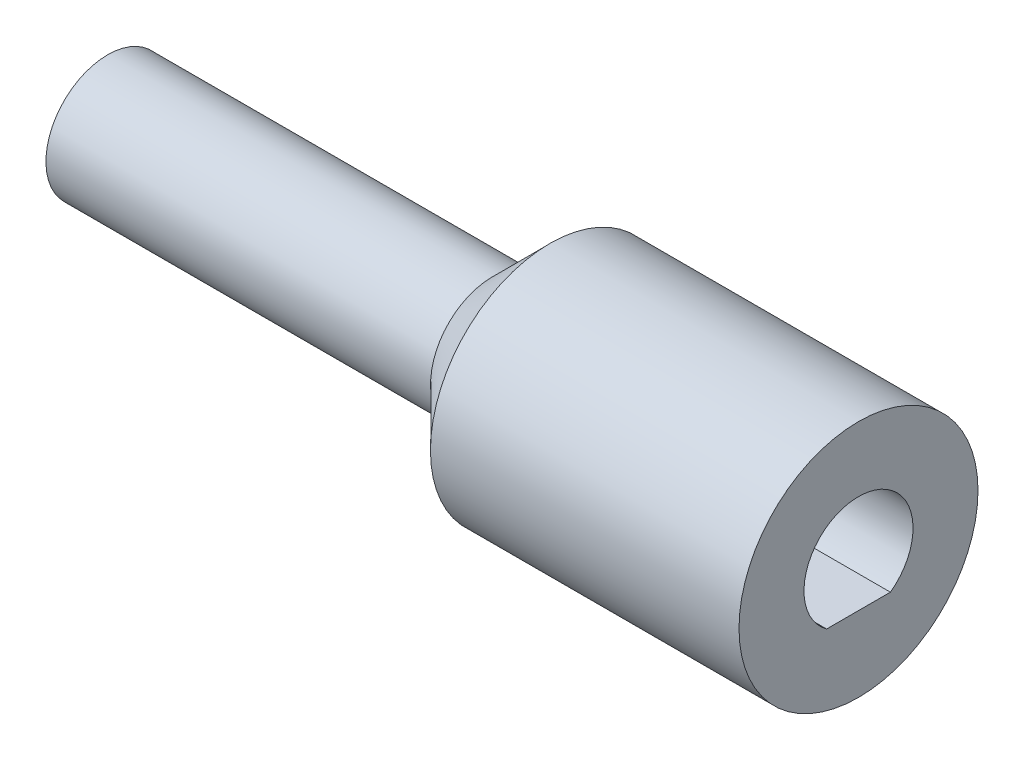
ISO-10303-21;
HEADER;
FILE_DESCRIPTION(('STEP AP214'),'2;1');
FILE_NAME('part.step','',(''),(''),'','','');
FILE_SCHEMA(('AUTOMOTIVE_DESIGN { 1 0 10303 214 1 1 1 1 }'));
ENDSEC;
DATA;
#1=APPLICATION_CONTEXT('core data for automotive mechanical design processes');
#2=APPLICATION_PROTOCOL_DEFINITION('international standard','automotive_design',2000,#1);
#3=PRODUCT_CONTEXT('',#1,'mechanical');
#4=PRODUCT('Part','Part','',(#3));
#5=PRODUCT_RELATED_PRODUCT_CATEGORY('part','',(#4));
#6=PRODUCT_DEFINITION_FORMATION('','',#4);
#7=PRODUCT_DEFINITION_CONTEXT('part definition',#1,'design');
#8=PRODUCT_DEFINITION('design','',#6,#7);
#9=PRODUCT_DEFINITION_SHAPE('','',#8);
#10=(LENGTH_UNIT() NAMED_UNIT(*) SI_UNIT(.MILLI.,.METRE.));
#11=(NAMED_UNIT(*) PLANE_ANGLE_UNIT() SI_UNIT($,.RADIAN.));
#12=(NAMED_UNIT(*) SI_UNIT($,.STERADIAN.) SOLID_ANGLE_UNIT());
#13=UNCERTAINTY_MEASURE_WITH_UNIT(LENGTH_MEASURE(1.E-05),#10,'distance_accuracy_value','');
#14=(GEOMETRIC_REPRESENTATION_CONTEXT(3) GLOBAL_UNCERTAINTY_ASSIGNED_CONTEXT((#13)) GLOBAL_UNIT_ASSIGNED_CONTEXT((#10,
#11,#12)) REPRESENTATION_CONTEXT('',''));
#15=CARTESIAN_POINT('',(0.,0.,0.));
#16=DIRECTION('',(0.,0.,1.));
#17=DIRECTION('',(1.,0.,0.));
#18=AXIS2_PLACEMENT_3D('',#15,#16,#17);
#19=CARTESIAN_POINT('',(-9.98528137423857,0.,0.));
#20=DIRECTION('',(1.,0.,0.));
#21=DIRECTION('',(0.,0.,-1.));
#22=AXIS2_PLACEMENT_3D('',#19,#20,#21);
#23=CYLINDRICAL_SURFACE('',#22,3.);
#24=CARTESIAN_POINT('',(17.2,0.,0.));
#25=DIRECTION('',(1.,0.,0.));
#26=DIRECTION('',(0.,0.,-1.));
#27=AXIS2_PLACEMENT_3D('',#24,#25,#26);
#28=CIRCLE('',#27,3.);
#29=CARTESIAN_POINT('',(17.2,0.,-3.00000000000002));
#30=VERTEX_POINT('',#29);
#31=EDGE_CURVE('E12',#30,#30,#28,.F.);
#32=ORIENTED_EDGE('',*,*,#31,.T.);
#33=EDGE_LOOP('',(#32));
#34=FACE_BOUND('',#33,.T.);
#35=CARTESIAN_POINT('',(-1.5,0.,0.));
#36=DIRECTION('',(1.,0.,0.));
#37=DIRECTION('',(0.,1.,0.));
#38=AXIS2_PLACEMENT_3D('',#35,#36,#37);
#39=CIRCLE('',#38,3.);
#40=CARTESIAN_POINT('',(-1.5,3.,0.));
#41=VERTEX_POINT('',#40);
#42=EDGE_CURVE('E96',#41,#41,#39,.F.);
#43=ORIENTED_EDGE('',*,*,#42,.F.);
#44=EDGE_LOOP('',(#43));
#45=FACE_BOUND('',#44,.T.);
#46=ADVANCED_FACE('F48',(#34,#45),#23,.T.);
#47=CARTESIAN_POINT('',(-1.5,0.,-2.17820349042522E-13));
#48=DIRECTION('',(1.,0.,0.));
#49=DIRECTION('',(0.,0.999995575602302,-0.00297468919731416));
#50=AXIS2_PLACEMENT_3D('',#47,#48,#49);
#51=PLANE('',#50);
#52=ORIENTED_EDGE('',*,*,#42,.T.);
#53=EDGE_LOOP('',(#52));
#54=FACE_BOUND('',#53,.T.);
#55=ADVANCED_FACE('F112',(#54),#51,.F.);
#56=CARTESIAN_POINT('',(35.,-2.14941852602045,0.));
#57=DIRECTION('',(0.,1.,0.));
#58=DIRECTION('',(0.,0.,1.));
#59=AXIS2_PLACEMENT_3D('',#56,#57,#58);
#60=PLANE('',#59);
#61=DIRECTION('',(0.,0.,-1.));
#62=VECTOR('',#61,1.);
#63=CARTESIAN_POINT('',(20.,-2.14941852602045,0.));
#64=LINE('',#63,#62);
#65=CARTESIAN_POINT('',(20.,-2.14941852602044,1.54999999999999));
#66=VERTEX_POINT('',#65);
#67=CARTESIAN_POINT('',(20.,-2.14941852602045,-1.55));
#68=VERTEX_POINT('',#67);
#69=EDGE_CURVE('E77',#66,#68,#64,.T.);
#70=ORIENTED_EDGE('',*,*,#69,.F.);
#71=DIRECTION('',(-1.,0.,0.));
#72=VECTOR('',#71,1.);
#73=CARTESIAN_POINT('',(35.,-2.14941852602045,1.55));
#74=LINE('',#73,#72);
#75=CARTESIAN_POINT('',(35.,-2.14941852602045,1.55));
#76=VERTEX_POINT('',#75);
#77=EDGE_CURVE('E85',#76,#66,#74,.T.);
#78=ORIENTED_EDGE('',*,*,#77,.F.);
#79=DIRECTION('',(0.,0.,-1.));
#80=VECTOR('',#79,1.);
#81=CARTESIAN_POINT('',(35.,-2.14941852602045,0.));
#82=LINE('',#81,#80);
#83=CARTESIAN_POINT('',(35.,-2.14941852602045,-1.55));
#84=VERTEX_POINT('',#83);
#85=EDGE_CURVE('E83',#76,#84,#82,.T.);
#86=ORIENTED_EDGE('',*,*,#85,.T.);
#87=DIRECTION('',(-1.,0.,0.));
#88=VECTOR('',#87,1.);
#89=CARTESIAN_POINT('',(35.,-2.14941852602045,-1.55));
#90=LINE('',#89,#88);
#91=EDGE_CURVE('E71',#84,#68,#90,.T.);
#92=ORIENTED_EDGE('',*,*,#91,.T.);
#93=EDGE_LOOP('',(#70,#78,#86,#92));
#94=FACE_BOUND('',#93,.T.);
#95=ADVANCED_FACE('F81',(#94),#60,.T.);
#96=CARTESIAN_POINT('',(35.,0.,0.));
#97=DIRECTION('',(-1.,0.,0.));
#98=DIRECTION('',(0.,0.,1.));
#99=AXIS2_PLACEMENT_3D('',#96,#97,#98);
#100=CYLINDRICAL_SURFACE('',#99,2.64999999999999);
#101=CARTESIAN_POINT('',(20.,0.,0.));
#102=DIRECTION('',(1.,0.,0.));
#103=DIRECTION('',(0.,0.,-1.));
#104=AXIS2_PLACEMENT_3D('',#101,#102,#103);
#105=CIRCLE('',#104,2.64999999999999);
#106=EDGE_CURVE('E63',#68,#66,#105,.T.);
#107=ORIENTED_EDGE('',*,*,#106,.F.);
#108=ORIENTED_EDGE('',*,*,#91,.F.);
#109=CARTESIAN_POINT('',(35.,0.,0.));
#110=DIRECTION('',(1.,0.,0.));
#111=DIRECTION('',(0.,0.,-1.));
#112=AXIS2_PLACEMENT_3D('',#109,#110,#111);
#113=CIRCLE('',#112,2.64999999999999);
#114=EDGE_CURVE('E139',#84,#76,#113,.T.);
#115=ORIENTED_EDGE('',*,*,#114,.T.);
#116=ORIENTED_EDGE('',*,*,#77,.T.);
#117=EDGE_LOOP('',(#107,#108,#115,#116));
#118=FACE_BOUND('',#117,.T.);
#119=ADVANCED_FACE('F88',(#118),#100,.F.);
#120=CARTESIAN_POINT('',(35.,0.,0.));
#121=DIRECTION('',(-1.,0.,0.));
#122=DIRECTION('',(0.,0.,1.));
#123=AXIS2_PLACEMENT_3D('',#120,#121,#122);
#124=CYLINDRICAL_SURFACE('',#123,5.80887283080937);
#125=CARTESIAN_POINT('',(35.,0.,0.));
#126=DIRECTION('',(1.,0.,0.));
#127=DIRECTION('',(0.,0.,-1.));
#128=AXIS2_PLACEMENT_3D('',#125,#126,#127);
#129=CIRCLE('',#128,5.80887283080937);
#130=CARTESIAN_POINT('',(35.,0.,-5.80887283080939));
#131=VERTEX_POINT('',#130);
#132=EDGE_CURVE('E86',#131,#131,#129,.T.);
#133=ORIENTED_EDGE('',*,*,#132,.F.);
#134=EDGE_LOOP('',(#133));
#135=FACE_BOUND('',#134,.T.);
#136=CARTESIAN_POINT('',(20.,0.,0.));
#137=DIRECTION('',(1.,0.,0.));
#138=DIRECTION('',(0.,0.,-1.));
#139=AXIS2_PLACEMENT_3D('',#136,#137,#138);
#140=CIRCLE('',#139,5.80887283080937);
#141=CARTESIAN_POINT('',(20.,0.,-5.80887283080939));
#142=VERTEX_POINT('',#141);
#143=EDGE_CURVE('E89',#142,#142,#140,.T.);
#144=ORIENTED_EDGE('',*,*,#143,.T.);
#145=EDGE_LOOP('',(#144));
#146=FACE_BOUND('',#145,.T.);
#147=ADVANCED_FACE('F126',(#135,#146),#124,.T.);
#148=CARTESIAN_POINT('',(35.,0.,0.));
#149=DIRECTION('',(1.,0.,0.));
#150=DIRECTION('',(0.,0.,-1.));
#151=AXIS2_PLACEMENT_3D('',#148,#149,#150);
#152=PLANE('',#151);
#153=ORIENTED_EDGE('',*,*,#85,.F.);
#154=ORIENTED_EDGE('',*,*,#114,.F.);
#155=EDGE_LOOP('',(#153,#154));
#156=FACE_BOUND('',#155,.T.);
#157=ORIENTED_EDGE('',*,*,#132,.T.);
#158=EDGE_LOOP('',(#157));
#159=FACE_BOUND('',#158,.T.);
#160=ADVANCED_FACE('F129',(#156,#159),#152,.T.);
#161=CARTESIAN_POINT('',(20.,0.,0.));
#162=DIRECTION('',(1.,0.,0.));
#163=DIRECTION('',(0.,0.,-1.));
#164=AXIS2_PLACEMENT_3D('',#161,#162,#163);
#165=PLANE('',#164);
#166=CARTESIAN_POINT('',(20.,0.,0.));
#167=DIRECTION('',(1.,0.,0.));
#168=DIRECTION('',(0.,0.,-1.));
#169=AXIS2_PLACEMENT_3D('',#166,#167,#168);
#170=CIRCLE('',#169,5.80000000000002);
#171=CARTESIAN_POINT('',(20.,0.,-5.80000000000004));
#172=VERTEX_POINT('',#171);
#173=EDGE_CURVE('E57',#172,#172,#170,.T.);
#174=ORIENTED_EDGE('',*,*,#173,.T.);
#175=EDGE_LOOP('',(#174));
#176=FACE_BOUND('',#175,.T.);
#177=ORIENTED_EDGE('',*,*,#143,.F.);
#178=EDGE_LOOP('',(#177));
#179=FACE_BOUND('',#178,.T.);
#180=ADVANCED_FACE('F101',(#176,#179),#165,.F.);
#181=CARTESIAN_POINT('',(20.,0.,0.));
#182=DIRECTION('',(1.,0.,0.));
#183=DIRECTION('',(0.,0.,-1.));
#184=AXIS2_PLACEMENT_3D('',#181,#182,#183);
#185=PLANE('',#184);
#186=ORIENTED_EDGE('',*,*,#69,.T.);
#187=ORIENTED_EDGE('',*,*,#106,.T.);
#188=EDGE_LOOP('',(#186,#187));
#189=FACE_BOUND('',#188,.T.);
#190=ADVANCED_FACE('F78',(#189),#185,.T.);
#191=CARTESIAN_POINT('',(20.,0.,0.));
#192=DIRECTION('',(1.,0.,0.));
#193=DIRECTION('',(0.,0.,-1.));
#194=AXIS2_PLACEMENT_3D('',#191,#192,#193);
#195=CONICAL_SURFACE('',#194,5.80000000000002,0.785398163397453);
#196=ORIENTED_EDGE('',*,*,#31,.F.);
#197=EDGE_LOOP('',(#196));
#198=FACE_BOUND('',#197,.T.);
#199=ORIENTED_EDGE('',*,*,#173,.F.);
#200=EDGE_LOOP('',(#199));
#201=FACE_BOUND('',#200,.T.);
#202=ADVANCED_FACE('F51',(#198,#201),#195,.T.);
#203=CLOSED_SHELL('',(#46,#55,#95,#119,#147,#160,#180,#190,#202));
#204=MANIFOLD_SOLID_BREP('B2',#203);
#205=ADVANCED_BREP_SHAPE_REPRESENTATION('',(#18,#204),#14);
#206=SHAPE_DEFINITION_REPRESENTATION(#9,#205);
ENDSEC;
END-ISO-10303-21;
